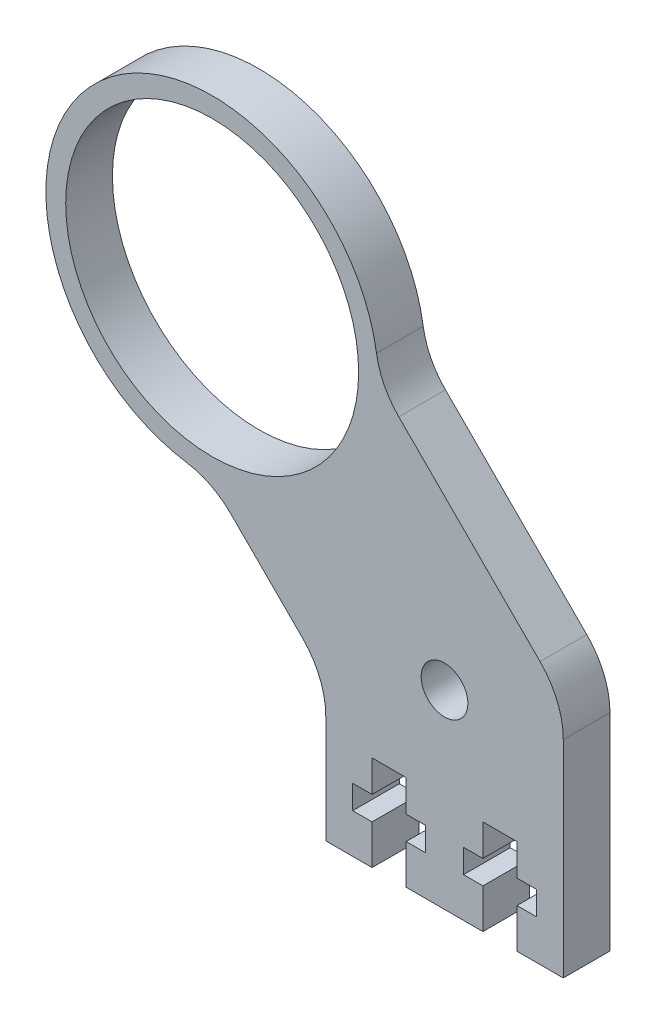
ISO-10303-21;
HEADER;
FILE_DESCRIPTION(('STEP AP214'),'2;1');
FILE_NAME('part.step','',(''),(''),'','','');
FILE_SCHEMA(('AUTOMOTIVE_DESIGN { 1 0 10303 214 1 1 1 1 }'));
ENDSEC;
DATA;
#1=APPLICATION_CONTEXT('core data for automotive mechanical design processes');
#2=APPLICATION_PROTOCOL_DEFINITION('international standard','automotive_design',2000,#1);
#3=PRODUCT_CONTEXT('',#1,'mechanical');
#4=PRODUCT('Part','Part','',(#3));
#5=PRODUCT_RELATED_PRODUCT_CATEGORY('part','',(#4));
#6=PRODUCT_DEFINITION_FORMATION('','',#4);
#7=PRODUCT_DEFINITION_CONTEXT('part definition',#1,'design');
#8=PRODUCT_DEFINITION('design','',#6,#7);
#9=PRODUCT_DEFINITION_SHAPE('','',#8);
#10=(LENGTH_UNIT() NAMED_UNIT(*) SI_UNIT(.MILLI.,.METRE.));
#11=(NAMED_UNIT(*) PLANE_ANGLE_UNIT() SI_UNIT($,.RADIAN.));
#12=(NAMED_UNIT(*) SI_UNIT($,.STERADIAN.) SOLID_ANGLE_UNIT());
#13=UNCERTAINTY_MEASURE_WITH_UNIT(LENGTH_MEASURE(1.E-05),#10,'distance_accuracy_value','');
#14=(GEOMETRIC_REPRESENTATION_CONTEXT(3) GLOBAL_UNCERTAINTY_ASSIGNED_CONTEXT((#13)) GLOBAL_UNIT_ASSIGNED_CONTEXT((#10,
#11,#12)) REPRESENTATION_CONTEXT('',''));
#15=CARTESIAN_POINT('',(0.,0.,0.));
#16=DIRECTION('',(0.,0.,1.));
#17=DIRECTION('',(1.,0.,0.));
#18=AXIS2_PLACEMENT_3D('',#15,#16,#17);
#19=CARTESIAN_POINT('',(-15.,-24.,5.9));
#20=DIRECTION('',(0.,1.,0.));
#21=DIRECTION('',(-1.,0.,0.));
#22=AXIS2_PLACEMENT_3D('',#19,#20,#21);
#23=PLANE('',#22);
#24=DIRECTION('',(1.,0.,0.));
#25=VECTOR('',#24,1.);
#26=CARTESIAN_POINT('',(-15.,-24.,5.9));
#27=LINE('',#26,#25);
#28=CARTESIAN_POINT('',(9.15000000000001,-24.,5.9));
#29=VERTEX_POINT('',#28);
#30=CARTESIAN_POINT('',(15.,-24.,5.9));
#31=VERTEX_POINT('',#30);
#32=EDGE_CURVE('E480',#29,#31,#27,.T.);
#33=ORIENTED_EDGE('',*,*,#32,.F.);
#34=DIRECTION('',(0.,0.,1.));
#35=VECTOR('',#34,1.);
#36=CARTESIAN_POINT('',(9.15000000000001,-24.,0.));
#37=LINE('',#36,#35);
#38=CARTESIAN_POINT('',(9.15000000000001,-24.,0.));
#39=VERTEX_POINT('',#38);
#40=EDGE_CURVE('E362',#39,#29,#37,.T.);
#41=ORIENTED_EDGE('',*,*,#40,.F.);
#42=DIRECTION('',(1.,0.,0.));
#43=VECTOR('',#42,1.);
#44=CARTESIAN_POINT('',(-15.,-24.,0.));
#45=LINE('',#44,#43);
#46=CARTESIAN_POINT('',(15.,-24.,0.));
#47=VERTEX_POINT('',#46);
#48=EDGE_CURVE('E498',#39,#47,#45,.T.);
#49=ORIENTED_EDGE('',*,*,#48,.T.);
#50=DIRECTION('',(0.,0.,-1.));
#51=VECTOR('',#50,1.);
#52=CARTESIAN_POINT('',(15.,-24.,5.9));
#53=LINE('',#52,#51);
#54=EDGE_CURVE('E491',#31,#47,#53,.T.);
#55=ORIENTED_EDGE('',*,*,#54,.F.);
#56=EDGE_LOOP('',(#33,#41,#49,#55));
#57=FACE_BOUND('',#56,.T.);
#58=ADVANCED_FACE('F45',(#57),#23,.F.);
#59=CARTESIAN_POINT('',(-15.,-24.,0.));
#60=VERTEX_POINT('',#59);
#61=CARTESIAN_POINT('',(-9.15,-24.,0.));
#62=VERTEX_POINT('',#61);
#63=EDGE_CURVE('E499',#60,#62,#45,.T.);
#64=ORIENTED_EDGE('',*,*,#63,.T.);
#65=DIRECTION('',(0.,0.,1.));
#66=VECTOR('',#65,1.);
#67=CARTESIAN_POINT('',(-9.15,-24.,0.));
#68=LINE('',#67,#66);
#69=CARTESIAN_POINT('',(-9.15,-24.,5.9));
#70=VERTEX_POINT('',#69);
#71=EDGE_CURVE('E404',#62,#70,#68,.T.);
#72=ORIENTED_EDGE('',*,*,#71,.T.);
#73=CARTESIAN_POINT('',(-15.,-24.,5.9));
#74=VERTEX_POINT('',#73);
#75=EDGE_CURVE('E481',#74,#70,#27,.T.);
#76=ORIENTED_EDGE('',*,*,#75,.F.);
#77=DIRECTION('',(0.,0.,-1.));
#78=VECTOR('',#77,1.);
#79=CARTESIAN_POINT('',(-15.,-24.,5.9));
#80=LINE('',#79,#78);
#81=EDGE_CURVE('E510',#74,#60,#80,.T.);
#82=ORIENTED_EDGE('',*,*,#81,.T.);
#83=EDGE_LOOP('',(#64,#72,#76,#82));
#84=FACE_BOUND('',#83,.T.);
#85=ADVANCED_FACE('F565',(#84),#23,.F.);
#86=CARTESIAN_POINT('',(-29.3449314192418,29.3449314192417,5.9));
#87=DIRECTION('',(0.,0.,1.));
#88=DIRECTION('',(1.,0.,0.));
#89=AXIS2_PLACEMENT_3D('',#86,#87,#88);
#90=PLANE('',#89);
#91=DIRECTION('',(0.,1.,0.));
#92=VECTOR('',#91,1.);
#93=CARTESIAN_POINT('',(15.,-24.,5.9));
#94=LINE('',#93,#92);
#95=CARTESIAN_POINT('',(15.,2.07106781186548,5.9));
#96=VERTEX_POINT('',#95);
#97=EDGE_CURVE('E484',#31,#96,#94,.T.);
#98=ORIENTED_EDGE('',*,*,#97,.T.);
#99=CARTESIAN_POINT('',(5.,2.07106781186548,5.9));
#100=DIRECTION('',(0.,0.,1.));
#101=DIRECTION('',(1.,0.,0.));
#102=AXIS2_PLACEMENT_3D('',#99,#100,#101);
#103=CIRCLE('',#102,10.);
#104=CARTESIAN_POINT('',(12.0710678118655,9.14213562373097,5.9));
#105=VERTEX_POINT('',#104);
#106=EDGE_CURVE('E527',#96,#105,#103,.T.);
#107=ORIENTED_EDGE('',*,*,#106,.T.);
#108=DIRECTION('',(-0.707106781186549,0.707106781186546,0.));
#109=VECTOR('',#108,1.);
#110=CARTESIAN_POINT('',(15.,6.21320343559644,5.9));
#111=LINE('',#110,#109);
#112=CARTESIAN_POINT('',(-5.77684830462785,26.9900517402242,5.9));
#113=VERTEX_POINT('',#112);
#114=EDGE_CURVE('E488',#105,#113,#111,.T.);
#115=ORIENTED_EDGE('',*,*,#114,.T.);
#116=CARTESIAN_POINT('',(1.29421950723762,34.0611195520897,5.9));
#117=DIRECTION('',(0.,0.,1.));
#118=DIRECTION('',(1.,0.,0.));
#119=AXIS2_PLACEMENT_3D('',#116,#117,#118);
#120=CIRCLE('',#119,10.);
#121=CARTESIAN_POINT('',(-8.58937756582025,32.5397685414936,5.9));
#122=VERTEX_POINT('',#121);
#123=EDGE_CURVE('E538',#113,#122,#120,.F.);
#124=ORIENTED_EDGE('',*,*,#123,.T.);
#125=CARTESIAN_POINT('',(-29.3449314192418,29.3449314192417,5.9));
#126=DIRECTION('',(0.,0.,1.));
#127=DIRECTION('',(1.,0.,0.));
#128=AXIS2_PLACEMENT_3D('',#125,#126,#127);
#129=CIRCLE('',#128,21.);
#130=CARTESIAN_POINT('',(-32.5397685414936,8.58937756582013,5.9));
#131=VERTEX_POINT('',#130);
#132=EDGE_CURVE('E472',#122,#131,#129,.T.);
#133=ORIENTED_EDGE('',*,*,#132,.T.);
#134=CARTESIAN_POINT('',(-34.0611195520897,-1.29421950723775,5.9));
#135=DIRECTION('',(0.,0.,1.));
#136=DIRECTION('',(1.,0.,0.));
#137=AXIS2_PLACEMENT_3D('',#134,#135,#136);
#138=CIRCLE('',#137,10.);
#139=CARTESIAN_POINT('',(-26.9900517402242,5.77684830462775,5.9));
#140=VERTEX_POINT('',#139);
#141=EDGE_CURVE('E13',#131,#140,#138,.F.);
#142=ORIENTED_EDGE('',*,*,#141,.T.);
#143=DIRECTION('',(0.707106781186549,-0.707106781186546,0.));
#144=VECTOR('',#143,1.);
#145=CARTESIAN_POINT('',(-15.,-6.21320343559645,5.9));
#146=LINE('',#145,#144);
#147=CARTESIAN_POINT('',(-17.9289321881345,-3.28427124746192,5.9));
#148=VERTEX_POINT('',#147);
#149=EDGE_CURVE('E475',#140,#148,#146,.T.);
#150=ORIENTED_EDGE('',*,*,#149,.T.);
#151=CARTESIAN_POINT('',(-25.,-10.3553390593274,5.9));
#152=DIRECTION('',(0.,0.,1.));
#153=DIRECTION('',(1.,0.,0.));
#154=AXIS2_PLACEMENT_3D('',#151,#152,#153);
#155=CIRCLE('',#154,10.);
#156=CARTESIAN_POINT('',(-15.,-10.3553390593274,5.9));
#157=VERTEX_POINT('',#156);
#158=EDGE_CURVE('E60',#148,#157,#155,.F.);
#159=ORIENTED_EDGE('',*,*,#158,.T.);
#160=DIRECTION('',(0.,-1.,0.));
#161=VECTOR('',#160,1.);
#162=CARTESIAN_POINT('',(-15.,-6.21320343559645,5.9));
#163=LINE('',#162,#161);
#164=EDGE_CURVE('E478',#157,#74,#163,.T.);
#165=ORIENTED_EDGE('',*,*,#164,.T.);
#166=ORIENTED_EDGE('',*,*,#75,.T.);
#167=DIRECTION('',(0.,-1.,0.));
#168=VECTOR('',#167,1.);
#169=CARTESIAN_POINT('',(-9.15,-24.,5.9));
#170=LINE('',#169,#168);
#171=CARTESIAN_POINT('',(-9.15,-19.,5.9));
#172=VERTEX_POINT('',#171);
#173=EDGE_CURVE('E349',#172,#70,#170,.T.);
#174=ORIENTED_EDGE('',*,*,#173,.F.);
#175=DIRECTION('',(1.,0.,0.));
#176=VECTOR('',#175,1.);
#177=CARTESIAN_POINT('',(-11.6,-19.,5.9));
#178=LINE('',#177,#176);
#179=CARTESIAN_POINT('',(-11.6,-19.,5.9));
#180=VERTEX_POINT('',#179);
#181=EDGE_CURVE('E374',#180,#172,#178,.T.);
#182=ORIENTED_EDGE('',*,*,#181,.F.);
#183=DIRECTION('',(0.,-1.,0.));
#184=VECTOR('',#183,1.);
#185=CARTESIAN_POINT('',(-11.6,-16.,5.9));
#186=LINE('',#185,#184);
#187=CARTESIAN_POINT('',(-11.6,-16.,5.9));
#188=VERTEX_POINT('',#187);
#189=EDGE_CURVE('E430',#188,#180,#186,.T.);
#190=ORIENTED_EDGE('',*,*,#189,.F.);
#191=DIRECTION('',(-1.,0.,0.));
#192=VECTOR('',#191,1.);
#193=CARTESIAN_POINT('',(-11.6,-16.,5.9));
#194=LINE('',#193,#192);
#195=CARTESIAN_POINT('',(-9.15,-16.,5.9));
#196=VERTEX_POINT('',#195);
#197=EDGE_CURVE('E427',#196,#188,#194,.T.);
#198=ORIENTED_EDGE('',*,*,#197,.F.);
#199=DIRECTION('',(0.,-1.,0.));
#200=VECTOR('',#199,1.);
#201=CARTESIAN_POINT('',(-9.15,-16.,5.9));
#202=LINE('',#201,#200);
#203=CARTESIAN_POINT('',(-9.15,-12.,5.9));
#204=VERTEX_POINT('',#203);
#205=EDGE_CURVE('E424',#204,#196,#202,.T.);
#206=ORIENTED_EDGE('',*,*,#205,.F.);
#207=DIRECTION('',(-1.,0.,0.));
#208=VECTOR('',#207,1.);
#209=CARTESIAN_POINT('',(-9.15,-12.,5.9));
#210=LINE('',#209,#208);
#211=CARTESIAN_POINT('',(-4.85,-12.,5.9));
#212=VERTEX_POINT('',#211);
#213=EDGE_CURVE('E421',#212,#204,#210,.T.);
#214=ORIENTED_EDGE('',*,*,#213,.F.);
#215=DIRECTION('',(0.,1.,0.));
#216=VECTOR('',#215,1.);
#217=CARTESIAN_POINT('',(-4.85,-16.,5.9));
#218=LINE('',#217,#216);
#219=CARTESIAN_POINT('',(-4.85,-16.,5.9));
#220=VERTEX_POINT('',#219);
#221=EDGE_CURVE('E418',#220,#212,#218,.T.);
#222=ORIENTED_EDGE('',*,*,#221,.F.);
#223=DIRECTION('',(-1.,0.,0.));
#224=VECTOR('',#223,1.);
#225=CARTESIAN_POINT('',(-4.85,-16.,5.9));
#226=LINE('',#225,#224);
#227=CARTESIAN_POINT('',(-2.4,-16.,5.9));
#228=VERTEX_POINT('',#227);
#229=EDGE_CURVE('E415',#228,#220,#226,.T.);
#230=ORIENTED_EDGE('',*,*,#229,.F.);
#231=DIRECTION('',(0.,1.,0.));
#232=VECTOR('',#231,1.);
#233=CARTESIAN_POINT('',(-2.4,-16.,5.9));
#234=LINE('',#233,#232);
#235=CARTESIAN_POINT('',(-2.4,-19.,5.9));
#236=VERTEX_POINT('',#235);
#237=EDGE_CURVE('E412',#236,#228,#234,.T.);
#238=ORIENTED_EDGE('',*,*,#237,.F.);
#239=DIRECTION('',(1.,0.,0.));
#240=VECTOR('',#239,1.);
#241=CARTESIAN_POINT('',(-4.85,-19.,5.9));
#242=LINE('',#241,#240);
#243=CARTESIAN_POINT('',(-4.85,-19.,5.9));
#244=VERTEX_POINT('',#243);
#245=EDGE_CURVE('E409',#244,#236,#242,.T.);
#246=ORIENTED_EDGE('',*,*,#245,.F.);
#247=DIRECTION('',(0.,1.,0.));
#248=VECTOR('',#247,1.);
#249=CARTESIAN_POINT('',(-4.84999999999999,-24.,5.9));
#250=LINE('',#249,#248);
#251=CARTESIAN_POINT('',(-4.84999999999999,-24.,5.9));
#252=VERTEX_POINT('',#251);
#253=EDGE_CURVE('E406',#252,#244,#250,.T.);
#254=ORIENTED_EDGE('',*,*,#253,.F.);
#255=CARTESIAN_POINT('',(4.85,-24.,5.9));
#256=VERTEX_POINT('',#255);
#257=EDGE_CURVE('E485',#252,#256,#27,.T.);
#258=ORIENTED_EDGE('',*,*,#257,.T.);
#259=DIRECTION('',(0.,-1.,0.));
#260=VECTOR('',#259,1.);
#261=CARTESIAN_POINT('',(4.85,-24.,5.9));
#262=LINE('',#261,#260);
#263=CARTESIAN_POINT('',(4.85,-19.,5.9));
#264=VERTEX_POINT('',#263);
#265=EDGE_CURVE('E328',#264,#256,#262,.T.);
#266=ORIENTED_EDGE('',*,*,#265,.F.);
#267=DIRECTION('',(1.,0.,0.));
#268=VECTOR('',#267,1.);
#269=CARTESIAN_POINT('',(4.85,-19.,5.9));
#270=LINE('',#269,#268);
#271=CARTESIAN_POINT('',(2.4,-19.,5.9));
#272=VERTEX_POINT('',#271);
#273=EDGE_CURVE('E325',#272,#264,#270,.T.);
#274=ORIENTED_EDGE('',*,*,#273,.F.);
#275=DIRECTION('',(0.,-1.,0.));
#276=VECTOR('',#275,1.);
#277=CARTESIAN_POINT('',(2.4,-16.,5.9));
#278=LINE('',#277,#276);
#279=CARTESIAN_POINT('',(2.4,-16.,5.9));
#280=VERTEX_POINT('',#279);
#281=EDGE_CURVE('E323',#280,#272,#278,.T.);
#282=ORIENTED_EDGE('',*,*,#281,.F.);
#283=DIRECTION('',(-1.,0.,0.));
#284=VECTOR('',#283,1.);
#285=CARTESIAN_POINT('',(4.85,-16.,5.9));
#286=LINE('',#285,#284);
#287=CARTESIAN_POINT('',(4.85,-16.,5.9));
#288=VERTEX_POINT('',#287);
#289=EDGE_CURVE('E274',#288,#280,#286,.T.);
#290=ORIENTED_EDGE('',*,*,#289,.F.);
#291=DIRECTION('',(0.,-1.,0.));
#292=VECTOR('',#291,1.);
#293=CARTESIAN_POINT('',(4.85,-16.,5.9));
#294=LINE('',#293,#292);
#295=CARTESIAN_POINT('',(4.85,-12.,5.9));
#296=VERTEX_POINT('',#295);
#297=EDGE_CURVE('E294',#296,#288,#294,.T.);
#298=ORIENTED_EDGE('',*,*,#297,.F.);
#299=DIRECTION('',(-1.,0.,0.));
#300=VECTOR('',#299,1.);
#301=CARTESIAN_POINT('',(9.15,-12.,5.9));
#302=LINE('',#301,#300);
#303=CARTESIAN_POINT('',(9.15,-12.,5.9));
#304=VERTEX_POINT('',#303);
#305=EDGE_CURVE('E297',#304,#296,#302,.T.);
#306=ORIENTED_EDGE('',*,*,#305,.F.);
#307=DIRECTION('',(0.,1.,0.));
#308=VECTOR('',#307,1.);
#309=CARTESIAN_POINT('',(9.15,-16.,5.9));
#310=LINE('',#309,#308);
#311=CARTESIAN_POINT('',(9.15,-16.,5.9));
#312=VERTEX_POINT('',#311);
#313=EDGE_CURVE('E342',#312,#304,#310,.T.);
#314=ORIENTED_EDGE('',*,*,#313,.F.);
#315=DIRECTION('',(-1.,0.,0.));
#316=VECTOR('',#315,1.);
#317=CARTESIAN_POINT('',(11.6,-16.,5.9));
#318=LINE('',#317,#316);
#319=CARTESIAN_POINT('',(11.6,-16.,5.9));
#320=VERTEX_POINT('',#319);
#321=EDGE_CURVE('E339',#320,#312,#318,.T.);
#322=ORIENTED_EDGE('',*,*,#321,.F.);
#323=DIRECTION('',(0.,1.,0.));
#324=VECTOR('',#323,1.);
#325=CARTESIAN_POINT('',(11.6,-16.,5.9));
#326=LINE('',#325,#324);
#327=CARTESIAN_POINT('',(11.6,-19.,5.9));
#328=VERTEX_POINT('',#327);
#329=EDGE_CURVE('E336',#328,#320,#326,.T.);
#330=ORIENTED_EDGE('',*,*,#329,.F.);
#331=DIRECTION('',(1.,0.,0.));
#332=VECTOR('',#331,1.);
#333=CARTESIAN_POINT('',(11.6,-19.,5.9));
#334=LINE('',#333,#332);
#335=CARTESIAN_POINT('',(9.15,-19.,5.9));
#336=VERTEX_POINT('',#335);
#337=EDGE_CURVE('E333',#336,#328,#334,.T.);
#338=ORIENTED_EDGE('',*,*,#337,.F.);
#339=DIRECTION('',(0.,1.,0.));
#340=VECTOR('',#339,1.);
#341=CARTESIAN_POINT('',(9.15000000000001,-24.,5.9));
#342=LINE('',#341,#340);
#343=EDGE_CURVE('E330',#29,#336,#342,.T.);
#344=ORIENTED_EDGE('',*,*,#343,.F.);
#345=ORIENTED_EDGE('',*,*,#32,.T.);
#346=EDGE_LOOP('',(#98,#107,#115,#124,#133,#142,#150,#159,#165,#166,#174,#182,#190,#198,#206,
#214,#222,#230,#238,#246,#254,#258,#266,#274,#282,#290,#298,#306,#314,#322,#330,#338,#344,#345));
#347=FACE_BOUND('',#346,.T.);
#348=CARTESIAN_POINT('',(-29.3449314192418,29.3449314192417,5.9));
#349=DIRECTION('',(0.,0.,1.));
#350=DIRECTION('',(1.,0.,0.));
#351=AXIS2_PLACEMENT_3D('',#348,#349,#350);
#352=CIRCLE('',#351,18.5);
#353=CARTESIAN_POINT('',(-10.8449314192418,29.3449314192417,5.9));
#354=VERTEX_POINT('',#353);
#355=EDGE_CURVE('E437',#354,#354,#352,.T.);
#356=ORIENTED_EDGE('',*,*,#355,.F.);
#357=EDGE_LOOP('',(#356));
#358=FACE_BOUND('',#357,.T.);
#359=CARTESIAN_POINT('',(0.,0.,5.9));
#360=DIRECTION('',(0.,0.,1.));
#361=DIRECTION('',(1.,0.,0.));
#362=AXIS2_PLACEMENT_3D('',#359,#360,#361);
#363=CIRCLE('',#362,2.95);
#364=CARTESIAN_POINT('',(2.95,0.,5.9));
#365=VERTEX_POINT('',#364);
#366=EDGE_CURVE('E466',#365,#365,#363,.T.);
#367=ORIENTED_EDGE('',*,*,#366,.F.);
#368=EDGE_LOOP('',(#367));
#369=FACE_BOUND('',#368,.T.);
#370=ADVANCED_FACE('F552',(#347,#358,#369),#90,.T.);
#371=CARTESIAN_POINT('',(-29.3449314192418,29.3449314192417,0.));
#372=DIRECTION('',(0.,0.,1.));
#373=DIRECTION('',(1.,0.,0.));
#374=AXIS2_PLACEMENT_3D('',#371,#372,#373);
#375=PLANE('',#374);
#376=DIRECTION('',(-0.707106781186549,0.707106781186546,0.));
#377=VECTOR('',#376,1.);
#378=CARTESIAN_POINT('',(15.,6.21320343559644,0.));
#379=LINE('',#378,#377);
#380=CARTESIAN_POINT('',(12.0710678118655,9.14213562373097,0.));
#381=VERTEX_POINT('',#380);
#382=CARTESIAN_POINT('',(-5.77684830462785,26.9900517402242,0.));
#383=VERTEX_POINT('',#382);
#384=EDGE_CURVE('E476',#381,#383,#379,.T.);
#385=ORIENTED_EDGE('',*,*,#384,.F.);
#386=CARTESIAN_POINT('',(5.,2.07106781186548,0.));
#387=DIRECTION('',(0.,0.,1.));
#388=DIRECTION('',(1.,0.,0.));
#389=AXIS2_PLACEMENT_3D('',#386,#387,#388);
#390=CIRCLE('',#389,10.);
#391=CARTESIAN_POINT('',(15.,2.07106781186548,0.));
#392=VERTEX_POINT('',#391);
#393=EDGE_CURVE('E523',#381,#392,#390,.F.);
#394=ORIENTED_EDGE('',*,*,#393,.T.);
#395=DIRECTION('',(0.,1.,0.));
#396=VECTOR('',#395,1.);
#397=CARTESIAN_POINT('',(15.,-24.,0.));
#398=LINE('',#397,#396);
#399=EDGE_CURVE('E502',#47,#392,#398,.T.);
#400=ORIENTED_EDGE('',*,*,#399,.F.);
#401=ORIENTED_EDGE('',*,*,#48,.F.);
#402=DIRECTION('',(0.,1.,0.));
#403=VECTOR('',#402,1.);
#404=CARTESIAN_POINT('',(9.15000000000001,-24.,0.));
#405=LINE('',#404,#403);
#406=CARTESIAN_POINT('',(9.15,-19.,0.));
#407=VERTEX_POINT('',#406);
#408=EDGE_CURVE('E304',#39,#407,#405,.T.);
#409=ORIENTED_EDGE('',*,*,#408,.T.);
#410=DIRECTION('',(1.,0.,0.));
#411=VECTOR('',#410,1.);
#412=CARTESIAN_POINT('',(11.6,-19.,0.));
#413=LINE('',#412,#411);
#414=CARTESIAN_POINT('',(11.6,-19.,0.));
#415=VERTEX_POINT('',#414);
#416=EDGE_CURVE('E307',#407,#415,#413,.T.);
#417=ORIENTED_EDGE('',*,*,#416,.T.);
#418=DIRECTION('',(0.,1.,0.));
#419=VECTOR('',#418,1.);
#420=CARTESIAN_POINT('',(11.6,-16.,0.));
#421=LINE('',#420,#419);
#422=CARTESIAN_POINT('',(11.6,-16.,0.));
#423=VERTEX_POINT('',#422);
#424=EDGE_CURVE('E310',#415,#423,#421,.T.);
#425=ORIENTED_EDGE('',*,*,#424,.T.);
#426=DIRECTION('',(-1.,0.,0.));
#427=VECTOR('',#426,1.);
#428=CARTESIAN_POINT('',(11.6,-16.,0.));
#429=LINE('',#428,#427);
#430=CARTESIAN_POINT('',(9.15,-16.,0.));
#431=VERTEX_POINT('',#430);
#432=EDGE_CURVE('E313',#423,#431,#429,.T.);
#433=ORIENTED_EDGE('',*,*,#432,.T.);
#434=DIRECTION('',(0.,1.,0.));
#435=VECTOR('',#434,1.);
#436=CARTESIAN_POINT('',(9.15,-16.,0.));
#437=LINE('',#436,#435);
#438=CARTESIAN_POINT('',(9.15,-12.,0.));
#439=VERTEX_POINT('',#438);
#440=EDGE_CURVE('E316',#431,#439,#437,.T.);
#441=ORIENTED_EDGE('',*,*,#440,.T.);
#442=DIRECTION('',(-1.,0.,0.));
#443=VECTOR('',#442,1.);
#444=CARTESIAN_POINT('',(9.15,-12.,0.));
#445=LINE('',#444,#443);
#446=CARTESIAN_POINT('',(4.85,-12.,0.));
#447=VERTEX_POINT('',#446);
#448=EDGE_CURVE('E319',#439,#447,#445,.T.);
#449=ORIENTED_EDGE('',*,*,#448,.T.);
#450=DIRECTION('',(0.,-1.,0.));
#451=VECTOR('',#450,1.);
#452=CARTESIAN_POINT('',(4.85,-16.,0.));
#453=LINE('',#452,#451);
#454=CARTESIAN_POINT('',(4.85,-16.,0.));
#455=VERTEX_POINT('',#454);
#456=EDGE_CURVE('E279',#447,#455,#453,.T.);
#457=ORIENTED_EDGE('',*,*,#456,.T.);
#458=DIRECTION('',(-1.,0.,0.));
#459=VECTOR('',#458,1.);
#460=CARTESIAN_POINT('',(4.85,-16.,0.));
#461=LINE('',#460,#459);
#462=CARTESIAN_POINT('',(2.4,-16.,0.));
#463=VERTEX_POINT('',#462);
#464=EDGE_CURVE('E271',#455,#463,#461,.T.);
#465=ORIENTED_EDGE('',*,*,#464,.T.);
#466=DIRECTION('',(0.,-1.,0.));
#467=VECTOR('',#466,1.);
#468=CARTESIAN_POINT('',(2.4,-16.,0.));
#469=LINE('',#468,#467);
#470=CARTESIAN_POINT('',(2.4,-19.,0.));
#471=VERTEX_POINT('',#470);
#472=EDGE_CURVE('E282',#463,#471,#469,.T.);
#473=ORIENTED_EDGE('',*,*,#472,.T.);
#474=DIRECTION('',(1.,0.,0.));
#475=VECTOR('',#474,1.);
#476=CARTESIAN_POINT('',(4.85,-19.,0.));
#477=LINE('',#476,#475);
#478=CARTESIAN_POINT('',(4.85,-19.,0.));
#479=VERTEX_POINT('',#478);
#480=EDGE_CURVE('E287',#471,#479,#477,.T.);
#481=ORIENTED_EDGE('',*,*,#480,.T.);
#482=DIRECTION('',(0.,-1.,0.));
#483=VECTOR('',#482,1.);
#484=CARTESIAN_POINT('',(4.85,-24.,0.));
#485=LINE('',#484,#483);
#486=CARTESIAN_POINT('',(4.85,-24.,0.));
#487=VERTEX_POINT('',#486);
#488=EDGE_CURVE('E301',#479,#487,#485,.T.);
#489=ORIENTED_EDGE('',*,*,#488,.T.);
#490=CARTESIAN_POINT('',(-4.85,-24.,0.));
#491=VERTEX_POINT('',#490);
#492=EDGE_CURVE('E503',#491,#487,#45,.T.);
#493=ORIENTED_EDGE('',*,*,#492,.F.);
#494=DIRECTION('',(0.,1.,0.));
#495=VECTOR('',#494,1.);
#496=CARTESIAN_POINT('',(-4.84999999999999,-24.,0.));
#497=LINE('',#496,#495);
#498=CARTESIAN_POINT('',(-4.85,-19.,0.));
#499=VERTEX_POINT('',#498);
#500=EDGE_CURVE('E373',#491,#499,#497,.T.);
#501=ORIENTED_EDGE('',*,*,#500,.T.);
#502=DIRECTION('',(1.,0.,0.));
#503=VECTOR('',#502,1.);
#504=CARTESIAN_POINT('',(-4.85,-19.,0.));
#505=LINE('',#504,#503);
#506=CARTESIAN_POINT('',(-2.4,-19.,0.));
#507=VERTEX_POINT('',#506);
#508=EDGE_CURVE('E377',#499,#507,#505,.T.);
#509=ORIENTED_EDGE('',*,*,#508,.T.);
#510=DIRECTION('',(0.,1.,0.));
#511=VECTOR('',#510,1.);
#512=CARTESIAN_POINT('',(-2.4,-16.,0.));
#513=LINE('',#512,#511);
#514=CARTESIAN_POINT('',(-2.4,-16.,0.));
#515=VERTEX_POINT('',#514);
#516=EDGE_CURVE('E380',#507,#515,#513,.T.);
#517=ORIENTED_EDGE('',*,*,#516,.T.);
#518=DIRECTION('',(-1.,0.,0.));
#519=VECTOR('',#518,1.);
#520=CARTESIAN_POINT('',(-4.85,-16.,0.));
#521=LINE('',#520,#519);
#522=CARTESIAN_POINT('',(-4.85,-16.,0.));
#523=VERTEX_POINT('',#522);
#524=EDGE_CURVE('E383',#515,#523,#521,.T.);
#525=ORIENTED_EDGE('',*,*,#524,.T.);
#526=DIRECTION('',(0.,1.,0.));
#527=VECTOR('',#526,1.);
#528=CARTESIAN_POINT('',(-4.85,-16.,0.));
#529=LINE('',#528,#527);
#530=CARTESIAN_POINT('',(-4.85,-12.,0.));
#531=VERTEX_POINT('',#530);
#532=EDGE_CURVE('E386',#523,#531,#529,.T.);
#533=ORIENTED_EDGE('',*,*,#532,.T.);
#534=DIRECTION('',(-1.,0.,0.));
#535=VECTOR('',#534,1.);
#536=CARTESIAN_POINT('',(-9.15,-12.,0.));
#537=LINE('',#536,#535);
#538=CARTESIAN_POINT('',(-9.15,-12.,0.));
#539=VERTEX_POINT('',#538);
#540=EDGE_CURVE('E389',#531,#539,#537,.T.);
#541=ORIENTED_EDGE('',*,*,#540,.T.);
#542=DIRECTION('',(0.,-1.,0.));
#543=VECTOR('',#542,1.);
#544=CARTESIAN_POINT('',(-9.15,-16.,0.));
#545=LINE('',#544,#543);
#546=CARTESIAN_POINT('',(-9.15,-16.,0.));
#547=VERTEX_POINT('',#546);
#548=EDGE_CURVE('E392',#539,#547,#545,.T.);
#549=ORIENTED_EDGE('',*,*,#548,.T.);
#550=DIRECTION('',(-1.,0.,0.));
#551=VECTOR('',#550,1.);
#552=CARTESIAN_POINT('',(-11.6,-16.,0.));
#553=LINE('',#552,#551);
#554=CARTESIAN_POINT('',(-11.6,-16.,0.));
#555=VERTEX_POINT('',#554);
#556=EDGE_CURVE('E395',#547,#555,#553,.T.);
#557=ORIENTED_EDGE('',*,*,#556,.T.);
#558=DIRECTION('',(0.,-1.,0.));
#559=VECTOR('',#558,1.);
#560=CARTESIAN_POINT('',(-11.6,-16.,0.));
#561=LINE('',#560,#559);
#562=CARTESIAN_POINT('',(-11.6,-19.,0.));
#563=VERTEX_POINT('',#562);
#564=EDGE_CURVE('E398',#555,#563,#561,.T.);
#565=ORIENTED_EDGE('',*,*,#564,.T.);
#566=DIRECTION('',(1.,0.,0.));
#567=VECTOR('',#566,1.);
#568=CARTESIAN_POINT('',(-11.6,-19.,0.));
#569=LINE('',#568,#567);
#570=CARTESIAN_POINT('',(-9.15,-19.,0.));
#571=VERTEX_POINT('',#570);
#572=EDGE_CURVE('E401',#563,#571,#569,.T.);
#573=ORIENTED_EDGE('',*,*,#572,.T.);
#574=DIRECTION('',(0.,-1.,0.));
#575=VECTOR('',#574,1.);
#576=CARTESIAN_POINT('',(-9.15,-24.,0.));
#577=LINE('',#576,#575);
#578=EDGE_CURVE('E370',#571,#62,#577,.T.);
#579=ORIENTED_EDGE('',*,*,#578,.T.);
#580=ORIENTED_EDGE('',*,*,#63,.F.);
#581=DIRECTION('',(0.,-1.,0.));
#582=VECTOR('',#581,1.);
#583=CARTESIAN_POINT('',(-15.,-6.21320343559645,0.));
#584=LINE('',#583,#582);
#585=CARTESIAN_POINT('',(-15.,-10.3553390593274,0.));
#586=VERTEX_POINT('',#585);
#587=EDGE_CURVE('E496',#586,#60,#584,.T.);
#588=ORIENTED_EDGE('',*,*,#587,.F.);
#589=CARTESIAN_POINT('',(-25.,-10.3553390593274,0.));
#590=DIRECTION('',(0.,0.,1.));
#591=DIRECTION('',(1.,0.,0.));
#592=AXIS2_PLACEMENT_3D('',#589,#590,#591);
#593=CIRCLE('',#592,10.);
#594=CARTESIAN_POINT('',(-17.9289321881345,-3.28427124746192,0.));
#595=VERTEX_POINT('',#594);
#596=EDGE_CURVE('E540',#586,#595,#593,.T.);
#597=ORIENTED_EDGE('',*,*,#596,.T.);
#598=DIRECTION('',(0.707106781186549,-0.707106781186546,0.));
#599=VECTOR('',#598,1.);
#600=CARTESIAN_POINT('',(-15.,-6.21320343559645,0.));
#601=LINE('',#600,#599);
#602=CARTESIAN_POINT('',(-26.9900517402242,5.77684830462775,0.));
#603=VERTEX_POINT('',#602);
#604=EDGE_CURVE('E494',#603,#595,#601,.T.);
#605=ORIENTED_EDGE('',*,*,#604,.F.);
#606=CARTESIAN_POINT('',(-34.0611195520897,-1.29421950723775,0.));
#607=DIRECTION('',(0.,0.,1.));
#608=DIRECTION('',(1.,0.,0.));
#609=AXIS2_PLACEMENT_3D('',#606,#607,#608);
#610=CIRCLE('',#609,10.);
#611=CARTESIAN_POINT('',(-32.5397685414936,8.58937756582013,0.));
#612=VERTEX_POINT('',#611);
#613=EDGE_CURVE('E53',#603,#612,#610,.T.);
#614=ORIENTED_EDGE('',*,*,#613,.T.);
#615=CARTESIAN_POINT('',(-29.3449314192418,29.3449314192417,0.));
#616=DIRECTION('',(0.,0.,1.));
#617=DIRECTION('',(1.,0.,0.));
#618=AXIS2_PLACEMENT_3D('',#615,#616,#617);
#619=CIRCLE('',#618,21.);
#620=CARTESIAN_POINT('',(-8.58937756582025,32.5397685414936,0.));
#621=VERTEX_POINT('',#620);
#622=EDGE_CURVE('E469',#621,#612,#619,.T.);
#623=ORIENTED_EDGE('',*,*,#622,.F.);
#624=CARTESIAN_POINT('',(1.29421950723762,34.0611195520897,0.));
#625=DIRECTION('',(0.,0.,1.));
#626=DIRECTION('',(1.,0.,0.));
#627=AXIS2_PLACEMENT_3D('',#624,#625,#626);
#628=CIRCLE('',#627,10.);
#629=EDGE_CURVE('E536',#621,#383,#628,.T.);
#630=ORIENTED_EDGE('',*,*,#629,.T.);
#631=EDGE_LOOP('',(#385,#394,#400,#401,#409,#417,#425,#433,#441,#449,#457,#465,#473,#481,#489,
#493,#501,#509,#517,#525,#533,#541,#549,#557,#565,#573,#579,#580,#588,#597,#605,#614,#623,#630));
#632=FACE_BOUND('',#631,.T.);
#633=CARTESIAN_POINT('',(-29.3449314192418,29.3449314192417,0.));
#634=DIRECTION('',(0.,0.,1.));
#635=DIRECTION('',(1.,0.,0.));
#636=AXIS2_PLACEMENT_3D('',#633,#634,#635);
#637=CIRCLE('',#636,18.5);
#638=CARTESIAN_POINT('',(-10.8449314192418,29.3449314192417,0.));
#639=VERTEX_POINT('',#638);
#640=EDGE_CURVE('E460',#639,#639,#637,.T.);
#641=ORIENTED_EDGE('',*,*,#640,.T.);
#642=EDGE_LOOP('',(#641));
#643=FACE_BOUND('',#642,.T.);
#644=CARTESIAN_POINT('',(0.,0.,0.));
#645=DIRECTION('',(0.,0.,1.));
#646=DIRECTION('',(1.,0.,0.));
#647=AXIS2_PLACEMENT_3D('',#644,#645,#646);
#648=CIRCLE('',#647,2.95);
#649=CARTESIAN_POINT('',(2.95,0.,0.));
#650=VERTEX_POINT('',#649);
#651=EDGE_CURVE('E463',#650,#650,#648,.T.);
#652=ORIENTED_EDGE('',*,*,#651,.T.);
#653=EDGE_LOOP('',(#652));
#654=FACE_BOUND('',#653,.T.);
#655=ADVANCED_FACE('F290',(#632,#643,#654),#375,.F.);
#656=CARTESIAN_POINT('',(-29.3449314192418,29.3449314192417,5.9));
#657=DIRECTION('',(0.,0.,-1.));
#658=DIRECTION('',(-1.,0.,0.));
#659=AXIS2_PLACEMENT_3D('',#656,#657,#658);
#660=CYLINDRICAL_SURFACE('',#659,21.);
#661=ORIENTED_EDGE('',*,*,#132,.F.);
#662=DIRECTION('',(0.,0.,-1.));
#663=VECTOR('',#662,1.);
#664=CARTESIAN_POINT('',(-8.58937756582025,32.5397685414936,5.9));
#665=LINE('',#664,#663);
#666=EDGE_CURVE('E515',#122,#621,#665,.T.);
#667=ORIENTED_EDGE('',*,*,#666,.T.);
#668=ORIENTED_EDGE('',*,*,#622,.T.);
#669=DIRECTION('',(0.,0.,-1.));
#670=VECTOR('',#669,1.);
#671=CARTESIAN_POINT('',(-32.5397685414936,8.58937756582013,5.9));
#672=LINE('',#671,#670);
#673=EDGE_CURVE('E513',#612,#131,#672,.F.);
#674=ORIENTED_EDGE('',*,*,#673,.T.);
#675=EDGE_LOOP('',(#661,#667,#668,#674));
#676=FACE_BOUND('',#675,.T.);
#677=ADVANCED_FACE('F549',(#676),#660,.T.);
#678=CARTESIAN_POINT('',(-15.,-6.21320343559645,5.9));
#679=DIRECTION('',(0.707106781186546,0.707106781186549,0.));
#680=DIRECTION('',(-0.707106781186549,0.707106781186546,0.));
#681=AXIS2_PLACEMENT_3D('',#678,#679,#680);
#682=PLANE('',#681);
#683=ORIENTED_EDGE('',*,*,#604,.T.);
#684=DIRECTION('',(0.,0.,-1.));
#685=VECTOR('',#684,1.);
#686=CARTESIAN_POINT('',(-17.9289321881345,-3.28427124746192,5.9));
#687=LINE('',#686,#685);
#688=EDGE_CURVE('E68',#595,#148,#687,.F.);
#689=ORIENTED_EDGE('',*,*,#688,.T.);
#690=ORIENTED_EDGE('',*,*,#149,.F.);
#691=DIRECTION('',(0.,0.,1.));
#692=VECTOR('',#691,1.);
#693=CARTESIAN_POINT('',(-26.9900517402242,5.77684830462775,0.));
#694=LINE('',#693,#692);
#695=EDGE_CURVE('E532',#140,#603,#694,.F.);
#696=ORIENTED_EDGE('',*,*,#695,.T.);
#697=EDGE_LOOP('',(#683,#689,#690,#696));
#698=FACE_BOUND('',#697,.T.);
#699=ADVANCED_FACE('F554',(#698),#682,.F.);
#700=CARTESIAN_POINT('',(-15.,-6.21320343559645,5.9));
#701=DIRECTION('',(1.,0.,0.));
#702=DIRECTION('',(0.,1.,0.));
#703=AXIS2_PLACEMENT_3D('',#700,#701,#702);
#704=PLANE('',#703);
#705=ORIENTED_EDGE('',*,*,#164,.F.);
#706=DIRECTION('',(0.,0.,-1.));
#707=VECTOR('',#706,1.);
#708=CARTESIAN_POINT('',(-15.,-10.3553390593274,0.));
#709=LINE('',#708,#707);
#710=EDGE_CURVE('E529',#157,#586,#709,.T.);
#711=ORIENTED_EDGE('',*,*,#710,.T.);
#712=ORIENTED_EDGE('',*,*,#587,.T.);
#713=ORIENTED_EDGE('',*,*,#81,.F.);
#714=EDGE_LOOP('',(#705,#711,#712,#713));
#715=FACE_BOUND('',#714,.T.);
#716=ADVANCED_FACE('F560',(#715),#704,.F.);
#717=ORIENTED_EDGE('',*,*,#492,.T.);
#718=DIRECTION('',(0.,0.,1.));
#719=VECTOR('',#718,1.);
#720=CARTESIAN_POINT('',(4.85,-24.,0.));
#721=LINE('',#720,#719);
#722=EDGE_CURVE('E364',#487,#256,#721,.T.);
#723=ORIENTED_EDGE('',*,*,#722,.T.);
#724=ORIENTED_EDGE('',*,*,#257,.F.);
#725=DIRECTION('',(0.,0.,1.));
#726=VECTOR('',#725,1.);
#727=CARTESIAN_POINT('',(-4.84999999999999,-24.,0.));
#728=LINE('',#727,#726);
#729=EDGE_CURVE('E456',#491,#252,#728,.T.);
#730=ORIENTED_EDGE('',*,*,#729,.F.);
#731=EDGE_LOOP('',(#717,#723,#724,#730));
#732=FACE_BOUND('',#731,.T.);
#733=ADVANCED_FACE('F615',(#732),#23,.F.);
#734=CARTESIAN_POINT('',(15.,-24.,5.9));
#735=DIRECTION('',(-1.,0.,0.));
#736=DIRECTION('',(0.,-1.,0.));
#737=AXIS2_PLACEMENT_3D('',#734,#735,#736);
#738=PLANE('',#737);
#739=ORIENTED_EDGE('',*,*,#399,.T.);
#740=DIRECTION('',(0.,0.,-1.));
#741=VECTOR('',#740,1.);
#742=CARTESIAN_POINT('',(15.,2.07106781186548,5.9));
#743=LINE('',#742,#741);
#744=EDGE_CURVE('E525',#392,#96,#743,.F.);
#745=ORIENTED_EDGE('',*,*,#744,.T.);
#746=ORIENTED_EDGE('',*,*,#97,.F.);
#747=ORIENTED_EDGE('',*,*,#54,.T.);
#748=EDGE_LOOP('',(#739,#745,#746,#747));
#749=FACE_BOUND('',#748,.T.);
#750=ADVANCED_FACE('F625',(#749),#738,.F.);
#751=CARTESIAN_POINT('',(15.,6.21320343559644,5.9));
#752=DIRECTION('',(-0.707106781186546,-0.707106781186549,0.));
#753=DIRECTION('',(0.707106781186549,-0.707106781186546,0.));
#754=AXIS2_PLACEMENT_3D('',#751,#752,#753);
#755=PLANE('',#754);
#756=ORIENTED_EDGE('',*,*,#384,.T.);
#757=DIRECTION('',(0.,0.,1.));
#758=VECTOR('',#757,1.);
#759=CARTESIAN_POINT('',(-5.77684830462785,26.9900517402242,5.9));
#760=LINE('',#759,#758);
#761=EDGE_CURVE('E521',#383,#113,#760,.T.);
#762=ORIENTED_EDGE('',*,*,#761,.T.);
#763=ORIENTED_EDGE('',*,*,#114,.F.);
#764=DIRECTION('',(0.,0.,-1.));
#765=VECTOR('',#764,1.);
#766=CARTESIAN_POINT('',(12.0710678118655,9.14213562373097,5.9));
#767=LINE('',#766,#765);
#768=EDGE_CURVE('E518',#105,#381,#767,.T.);
#769=ORIENTED_EDGE('',*,*,#768,.T.);
#770=EDGE_LOOP('',(#756,#762,#763,#769));
#771=FACE_BOUND('',#770,.T.);
#772=ADVANCED_FACE('F633',(#771),#755,.F.);
#773=CARTESIAN_POINT('',(0.,0.,5.9));
#774=DIRECTION('',(0.,0.,-1.));
#775=DIRECTION('',(-1.,0.,0.));
#776=AXIS2_PLACEMENT_3D('',#773,#774,#775);
#777=CYLINDRICAL_SURFACE('',#776,2.95);
#778=ORIENTED_EDGE('',*,*,#366,.T.);
#779=EDGE_LOOP('',(#778));
#780=FACE_BOUND('',#779,.T.);
#781=ORIENTED_EDGE('',*,*,#651,.F.);
#782=EDGE_LOOP('',(#781));
#783=FACE_BOUND('',#782,.T.);
#784=ADVANCED_FACE('F676',(#780,#783),#777,.F.);
#785=CARTESIAN_POINT('',(-29.3449314192418,29.3449314192417,0.));
#786=DIRECTION('',(0.,0.,1.));
#787=DIRECTION('',(1.,0.,0.));
#788=AXIS2_PLACEMENT_3D('',#785,#786,#787);
#789=CYLINDRICAL_SURFACE('',#788,18.5);
#790=ORIENTED_EDGE('',*,*,#640,.F.);
#791=EDGE_LOOP('',(#790));
#792=FACE_BOUND('',#791,.T.);
#793=ORIENTED_EDGE('',*,*,#355,.T.);
#794=EDGE_LOOP('',(#793));
#795=FACE_BOUND('',#794,.T.);
#796=ADVANCED_FACE('F680',(#792,#795),#789,.F.);
#797=CARTESIAN_POINT('',(-9.15,-24.,0.));
#798=DIRECTION('',(-1.,0.,0.));
#799=DIRECTION('',(0.,0.,1.));
#800=AXIS2_PLACEMENT_3D('',#797,#798,#799);
#801=PLANE('',#800);
#802=ORIENTED_EDGE('',*,*,#173,.T.);
#803=ORIENTED_EDGE('',*,*,#71,.F.);
#804=ORIENTED_EDGE('',*,*,#578,.F.);
#805=DIRECTION('',(0.,0.,1.));
#806=VECTOR('',#805,1.);
#807=CARTESIAN_POINT('',(-9.15,-19.,0.));
#808=LINE('',#807,#806);
#809=EDGE_CURVE('E435',#571,#172,#808,.T.);
#810=ORIENTED_EDGE('',*,*,#809,.T.);
#811=EDGE_LOOP('',(#802,#803,#804,#810));
#812=FACE_BOUND('',#811,.T.);
#813=ADVANCED_FACE('F571',(#812),#801,.F.);
#814=CARTESIAN_POINT('',(-11.6,-19.,0.));
#815=DIRECTION('',(0.,-1.,0.));
#816=DIRECTION('',(0.,0.,-1.));
#817=AXIS2_PLACEMENT_3D('',#814,#815,#816);
#818=PLANE('',#817);
#819=ORIENTED_EDGE('',*,*,#181,.T.);
#820=ORIENTED_EDGE('',*,*,#809,.F.);
#821=ORIENTED_EDGE('',*,*,#572,.F.);
#822=DIRECTION('',(0.,0.,1.));
#823=VECTOR('',#822,1.);
#824=CARTESIAN_POINT('',(-11.6,-19.,0.));
#825=LINE('',#824,#823);
#826=EDGE_CURVE('E438',#563,#180,#825,.T.);
#827=ORIENTED_EDGE('',*,*,#826,.T.);
#828=EDGE_LOOP('',(#819,#820,#821,#827));
#829=FACE_BOUND('',#828,.T.);
#830=ADVANCED_FACE('F574',(#829),#818,.F.);
#831=CARTESIAN_POINT('',(-11.6,-16.,0.));
#832=DIRECTION('',(-1.,0.,0.));
#833=DIRECTION('',(0.,-1.,0.));
#834=AXIS2_PLACEMENT_3D('',#831,#832,#833);
#835=PLANE('',#834);
#836=ORIENTED_EDGE('',*,*,#189,.T.);
#837=ORIENTED_EDGE('',*,*,#826,.F.);
#838=ORIENTED_EDGE('',*,*,#564,.F.);
#839=DIRECTION('',(0.,0.,1.));
#840=VECTOR('',#839,1.);
#841=CARTESIAN_POINT('',(-11.6,-16.,0.));
#842=LINE('',#841,#840);
#843=EDGE_CURVE('E440',#555,#188,#842,.T.);
#844=ORIENTED_EDGE('',*,*,#843,.T.);
#845=EDGE_LOOP('',(#836,#837,#838,#844));
#846=FACE_BOUND('',#845,.T.);
#847=ADVANCED_FACE('F577',(#846),#835,.F.);
#848=CARTESIAN_POINT('',(-11.6,-16.,0.));
#849=DIRECTION('',(0.,1.,0.));
#850=DIRECTION('',(0.,0.,1.));
#851=AXIS2_PLACEMENT_3D('',#848,#849,#850);
#852=PLANE('',#851);
#853=ORIENTED_EDGE('',*,*,#197,.T.);
#854=ORIENTED_EDGE('',*,*,#843,.F.);
#855=ORIENTED_EDGE('',*,*,#556,.F.);
#856=DIRECTION('',(0.,0.,1.));
#857=VECTOR('',#856,1.);
#858=CARTESIAN_POINT('',(-9.15,-16.,0.));
#859=LINE('',#858,#857);
#860=EDGE_CURVE('E442',#547,#196,#859,.T.);
#861=ORIENTED_EDGE('',*,*,#860,.T.);
#862=EDGE_LOOP('',(#853,#854,#855,#861));
#863=FACE_BOUND('',#862,.T.);
#864=ADVANCED_FACE('F582',(#863),#852,.F.);
#865=CARTESIAN_POINT('',(-9.15,-16.,0.));
#866=DIRECTION('',(-1.,0.,0.));
#867=DIRECTION('',(0.,-1.,0.));
#868=AXIS2_PLACEMENT_3D('',#865,#866,#867);
#869=PLANE('',#868);
#870=ORIENTED_EDGE('',*,*,#205,.T.);
#871=ORIENTED_EDGE('',*,*,#860,.F.);
#872=ORIENTED_EDGE('',*,*,#548,.F.);
#873=DIRECTION('',(0.,0.,1.));
#874=VECTOR('',#873,1.);
#875=CARTESIAN_POINT('',(-9.15,-12.,0.));
#876=LINE('',#875,#874);
#877=EDGE_CURVE('E444',#539,#204,#876,.T.);
#878=ORIENTED_EDGE('',*,*,#877,.T.);
#879=EDGE_LOOP('',(#870,#871,#872,#878));
#880=FACE_BOUND('',#879,.T.);
#881=ADVANCED_FACE('F586',(#880),#869,.F.);
#882=CARTESIAN_POINT('',(-9.15,-12.,0.));
#883=DIRECTION('',(0.,1.,0.));
#884=DIRECTION('',(0.,0.,1.));
#885=AXIS2_PLACEMENT_3D('',#882,#883,#884);
#886=PLANE('',#885);
#887=ORIENTED_EDGE('',*,*,#213,.T.);
#888=ORIENTED_EDGE('',*,*,#877,.F.);
#889=ORIENTED_EDGE('',*,*,#540,.F.);
#890=DIRECTION('',(0.,0.,1.));
#891=VECTOR('',#890,1.);
#892=CARTESIAN_POINT('',(-4.85,-12.,0.));
#893=LINE('',#892,#891);
#894=EDGE_CURVE('E446',#531,#212,#893,.T.);
#895=ORIENTED_EDGE('',*,*,#894,.T.);
#896=EDGE_LOOP('',(#887,#888,#889,#895));
#897=FACE_BOUND('',#896,.T.);
#898=ADVANCED_FACE('F589',(#897),#886,.F.);
#899=CARTESIAN_POINT('',(-4.85,-16.,0.));
#900=DIRECTION('',(1.,0.,0.));
#901=DIRECTION('',(0.,1.,0.));
#902=AXIS2_PLACEMENT_3D('',#899,#900,#901);
#903=PLANE('',#902);
#904=ORIENTED_EDGE('',*,*,#221,.T.);
#905=ORIENTED_EDGE('',*,*,#894,.F.);
#906=ORIENTED_EDGE('',*,*,#532,.F.);
#907=DIRECTION('',(0.,0.,1.));
#908=VECTOR('',#907,1.);
#909=CARTESIAN_POINT('',(-4.85,-16.,0.));
#910=LINE('',#909,#908);
#911=EDGE_CURVE('E448',#523,#220,#910,.T.);
#912=ORIENTED_EDGE('',*,*,#911,.T.);
#913=EDGE_LOOP('',(#904,#905,#906,#912));
#914=FACE_BOUND('',#913,.T.);
#915=ADVANCED_FACE('F594',(#914),#903,.F.);
#916=CARTESIAN_POINT('',(-4.85,-16.,0.));
#917=DIRECTION('',(0.,1.,0.));
#918=DIRECTION('',(0.,0.,1.));
#919=AXIS2_PLACEMENT_3D('',#916,#917,#918);
#920=PLANE('',#919);
#921=ORIENTED_EDGE('',*,*,#229,.T.);
#922=ORIENTED_EDGE('',*,*,#911,.F.);
#923=ORIENTED_EDGE('',*,*,#524,.F.);
#924=DIRECTION('',(0.,0.,1.));
#925=VECTOR('',#924,1.);
#926=CARTESIAN_POINT('',(-2.4,-16.,0.));
#927=LINE('',#926,#925);
#928=EDGE_CURVE('E450',#515,#228,#927,.T.);
#929=ORIENTED_EDGE('',*,*,#928,.T.);
#930=EDGE_LOOP('',(#921,#922,#923,#929));
#931=FACE_BOUND('',#930,.T.);
#932=ADVANCED_FACE('F598',(#931),#920,.F.);
#933=CARTESIAN_POINT('',(-2.4,-16.,0.));
#934=DIRECTION('',(1.,0.,0.));
#935=DIRECTION('',(0.,1.,0.));
#936=AXIS2_PLACEMENT_3D('',#933,#934,#935);
#937=PLANE('',#936);
#938=ORIENTED_EDGE('',*,*,#237,.T.);
#939=ORIENTED_EDGE('',*,*,#928,.F.);
#940=ORIENTED_EDGE('',*,*,#516,.F.);
#941=DIRECTION('',(0.,0.,1.));
#942=VECTOR('',#941,1.);
#943=CARTESIAN_POINT('',(-2.4,-19.,0.));
#944=LINE('',#943,#942);
#945=EDGE_CURVE('E452',#507,#236,#944,.T.);
#946=ORIENTED_EDGE('',*,*,#945,.T.);
#947=EDGE_LOOP('',(#938,#939,#940,#946));
#948=FACE_BOUND('',#947,.T.);
#949=ADVANCED_FACE('F601',(#948),#937,.F.);
#950=CARTESIAN_POINT('',(-4.85,-19.,0.));
#951=DIRECTION('',(0.,-1.,0.));
#952=DIRECTION('',(0.,0.,-1.));
#953=AXIS2_PLACEMENT_3D('',#950,#951,#952);
#954=PLANE('',#953);
#955=ORIENTED_EDGE('',*,*,#245,.T.);
#956=ORIENTED_EDGE('',*,*,#945,.F.);
#957=ORIENTED_EDGE('',*,*,#508,.F.);
#958=DIRECTION('',(0.,0.,1.));
#959=VECTOR('',#958,1.);
#960=CARTESIAN_POINT('',(-4.85,-19.,0.));
#961=LINE('',#960,#959);
#962=EDGE_CURVE('E454',#499,#244,#961,.T.);
#963=ORIENTED_EDGE('',*,*,#962,.T.);
#964=EDGE_LOOP('',(#955,#956,#957,#963));
#965=FACE_BOUND('',#964,.T.);
#966=ADVANCED_FACE('F607',(#965),#954,.F.);
#967=CARTESIAN_POINT('',(-4.84999999999999,-24.,0.));
#968=DIRECTION('',(1.,0.,0.));
#969=DIRECTION('',(0.,1.,0.));
#970=AXIS2_PLACEMENT_3D('',#967,#968,#969);
#971=PLANE('',#970);
#972=ORIENTED_EDGE('',*,*,#253,.T.);
#973=ORIENTED_EDGE('',*,*,#962,.F.);
#974=ORIENTED_EDGE('',*,*,#500,.F.);
#975=ORIENTED_EDGE('',*,*,#729,.T.);
#976=EDGE_LOOP('',(#972,#973,#974,#975));
#977=FACE_BOUND('',#976,.T.);
#978=ADVANCED_FACE('F610',(#977),#971,.F.);
#979=CARTESIAN_POINT('',(4.85,-16.,0.));
#980=DIRECTION('',(0.,1.,0.));
#981=DIRECTION('',(0.,0.,1.));
#982=AXIS2_PLACEMENT_3D('',#979,#980,#981);
#983=PLANE('',#982);
#984=ORIENTED_EDGE('',*,*,#289,.T.);
#985=DIRECTION('',(0.,0.,1.));
#986=VECTOR('',#985,1.);
#987=CARTESIAN_POINT('',(2.4,-16.,0.));
#988=LINE('',#987,#986);
#989=EDGE_CURVE('E267',#463,#280,#988,.T.);
#990=ORIENTED_EDGE('',*,*,#989,.F.);
#991=ORIENTED_EDGE('',*,*,#464,.F.);
#992=DIRECTION('',(0.,0.,1.));
#993=VECTOR('',#992,1.);
#994=CARTESIAN_POINT('',(4.85,-16.,0.));
#995=LINE('',#994,#993);
#996=EDGE_CURVE('E347',#455,#288,#995,.T.);
#997=ORIENTED_EDGE('',*,*,#996,.T.);
#998=EDGE_LOOP('',(#984,#990,#991,#997));
#999=FACE_BOUND('',#998,.T.);
#1000=ADVANCED_FACE('F269',(#999),#983,.F.);
#1001=CARTESIAN_POINT('',(4.85,-16.,0.));
#1002=DIRECTION('',(-1.,0.,0.));
#1003=DIRECTION('',(0.,-1.,0.));
#1004=AXIS2_PLACEMENT_3D('',#1001,#1002,#1003);
#1005=PLANE('',#1004);
#1006=ORIENTED_EDGE('',*,*,#297,.T.);
#1007=ORIENTED_EDGE('',*,*,#996,.F.);
#1008=ORIENTED_EDGE('',*,*,#456,.F.);
#1009=DIRECTION('',(0.,0.,1.));
#1010=VECTOR('',#1009,1.);
#1011=CARTESIAN_POINT('',(4.85,-12.,0.));
#1012=LINE('',#1011,#1010);
#1013=EDGE_CURVE('E350',#447,#296,#1012,.T.);
#1014=ORIENTED_EDGE('',*,*,#1013,.T.);
#1015=EDGE_LOOP('',(#1006,#1007,#1008,#1014));
#1016=FACE_BOUND('',#1015,.T.);
#1017=ADVANCED_FACE('F712',(#1016),#1005,.F.);
#1018=CARTESIAN_POINT('',(9.15,-12.,0.));
#1019=DIRECTION('',(0.,1.,0.));
#1020=DIRECTION('',(0.,0.,1.));
#1021=AXIS2_PLACEMENT_3D('',#1018,#1019,#1020);
#1022=PLANE('',#1021);
#1023=ORIENTED_EDGE('',*,*,#305,.T.);
#1024=ORIENTED_EDGE('',*,*,#1013,.F.);
#1025=ORIENTED_EDGE('',*,*,#448,.F.);
#1026=DIRECTION('',(0.,0.,1.));
#1027=VECTOR('',#1026,1.);
#1028=CARTESIAN_POINT('',(9.15,-12.,0.));
#1029=LINE('',#1028,#1027);
#1030=EDGE_CURVE('E352',#439,#304,#1029,.T.);
#1031=ORIENTED_EDGE('',*,*,#1030,.T.);
#1032=EDGE_LOOP('',(#1023,#1024,#1025,#1031));
#1033=FACE_BOUND('',#1032,.T.);
#1034=ADVANCED_FACE('F740',(#1033),#1022,.F.);
#1035=CARTESIAN_POINT('',(9.15,-16.,0.));
#1036=DIRECTION('',(1.,0.,0.));
#1037=DIRECTION('',(0.,1.,0.));
#1038=AXIS2_PLACEMENT_3D('',#1035,#1036,#1037);
#1039=PLANE('',#1038);
#1040=ORIENTED_EDGE('',*,*,#313,.T.);
#1041=ORIENTED_EDGE('',*,*,#1030,.F.);
#1042=ORIENTED_EDGE('',*,*,#440,.F.);
#1043=DIRECTION('',(0.,0.,1.));
#1044=VECTOR('',#1043,1.);
#1045=CARTESIAN_POINT('',(9.15,-16.,0.));
#1046=LINE('',#1045,#1044);
#1047=EDGE_CURVE('E354',#431,#312,#1046,.T.);
#1048=ORIENTED_EDGE('',*,*,#1047,.T.);
#1049=EDGE_LOOP('',(#1040,#1041,#1042,#1048));
#1050=FACE_BOUND('',#1049,.T.);
#1051=ADVANCED_FACE('F736',(#1050),#1039,.F.);
#1052=CARTESIAN_POINT('',(11.6,-16.,0.));
#1053=DIRECTION('',(0.,1.,0.));
#1054=DIRECTION('',(-1.,0.,0.));
#1055=AXIS2_PLACEMENT_3D('',#1052,#1053,#1054);
#1056=PLANE('',#1055);
#1057=ORIENTED_EDGE('',*,*,#321,.T.);
#1058=ORIENTED_EDGE('',*,*,#1047,.F.);
#1059=ORIENTED_EDGE('',*,*,#432,.F.);
#1060=DIRECTION('',(0.,0.,1.));
#1061=VECTOR('',#1060,1.);
#1062=CARTESIAN_POINT('',(11.6,-16.,0.));
#1063=LINE('',#1062,#1061);
#1064=EDGE_CURVE('E356',#423,#320,#1063,.T.);
#1065=ORIENTED_EDGE('',*,*,#1064,.T.);
#1066=EDGE_LOOP('',(#1057,#1058,#1059,#1065));
#1067=FACE_BOUND('',#1066,.T.);
#1068=ADVANCED_FACE('F732',(#1067),#1056,.F.);
#1069=CARTESIAN_POINT('',(11.6,-16.,0.));
#1070=DIRECTION('',(1.,0.,0.));
#1071=DIRECTION('',(0.,1.,0.));
#1072=AXIS2_PLACEMENT_3D('',#1069,#1070,#1071);
#1073=PLANE('',#1072);
#1074=ORIENTED_EDGE('',*,*,#329,.T.);
#1075=ORIENTED_EDGE('',*,*,#1064,.F.);
#1076=ORIENTED_EDGE('',*,*,#424,.F.);
#1077=DIRECTION('',(0.,0.,1.));
#1078=VECTOR('',#1077,1.);
#1079=CARTESIAN_POINT('',(11.6,-19.,0.));
#1080=LINE('',#1079,#1078);
#1081=EDGE_CURVE('E358',#415,#328,#1080,.T.);
#1082=ORIENTED_EDGE('',*,*,#1081,.T.);
#1083=EDGE_LOOP('',(#1074,#1075,#1076,#1082));
#1084=FACE_BOUND('',#1083,.T.);
#1085=ADVANCED_FACE('F728',(#1084),#1073,.F.);
#1086=CARTESIAN_POINT('',(11.6,-19.,0.));
#1087=DIRECTION('',(0.,-1.,0.));
#1088=DIRECTION('',(1.,0.,0.));
#1089=AXIS2_PLACEMENT_3D('',#1086,#1087,#1088);
#1090=PLANE('',#1089);
#1091=ORIENTED_EDGE('',*,*,#337,.T.);
#1092=ORIENTED_EDGE('',*,*,#1081,.F.);
#1093=ORIENTED_EDGE('',*,*,#416,.F.);
#1094=DIRECTION('',(0.,0.,1.));
#1095=VECTOR('',#1094,1.);
#1096=CARTESIAN_POINT('',(9.15,-19.,0.));
#1097=LINE('',#1096,#1095);
#1098=EDGE_CURVE('E360',#407,#336,#1097,.T.);
#1099=ORIENTED_EDGE('',*,*,#1098,.T.);
#1100=EDGE_LOOP('',(#1091,#1092,#1093,#1099));
#1101=FACE_BOUND('',#1100,.T.);
#1102=ADVANCED_FACE('F724',(#1101),#1090,.F.);
#1103=CARTESIAN_POINT('',(9.15000000000001,-24.,0.));
#1104=DIRECTION('',(1.,0.,0.));
#1105=DIRECTION('',(0.,1.,0.));
#1106=AXIS2_PLACEMENT_3D('',#1103,#1104,#1105);
#1107=PLANE('',#1106);
#1108=ORIENTED_EDGE('',*,*,#343,.T.);
#1109=ORIENTED_EDGE('',*,*,#1098,.F.);
#1110=ORIENTED_EDGE('',*,*,#408,.F.);
#1111=ORIENTED_EDGE('',*,*,#40,.T.);
#1112=EDGE_LOOP('',(#1108,#1109,#1110,#1111));
#1113=FACE_BOUND('',#1112,.T.);
#1114=ADVANCED_FACE('F720',(#1113),#1107,.F.);
#1115=CARTESIAN_POINT('',(4.85,-24.,0.));
#1116=DIRECTION('',(-1.,0.,0.));
#1117=DIRECTION('',(0.,-1.,0.));
#1118=AXIS2_PLACEMENT_3D('',#1115,#1116,#1117);
#1119=PLANE('',#1118);
#1120=ORIENTED_EDGE('',*,*,#265,.T.);
#1121=ORIENTED_EDGE('',*,*,#722,.F.);
#1122=ORIENTED_EDGE('',*,*,#488,.F.);
#1123=DIRECTION('',(0.,0.,1.));
#1124=VECTOR('',#1123,1.);
#1125=CARTESIAN_POINT('',(4.85,-19.,0.));
#1126=LINE('',#1125,#1124);
#1127=EDGE_CURVE('E367',#479,#264,#1126,.T.);
#1128=ORIENTED_EDGE('',*,*,#1127,.T.);
#1129=EDGE_LOOP('',(#1120,#1121,#1122,#1128));
#1130=FACE_BOUND('',#1129,.T.);
#1131=ADVANCED_FACE('F716',(#1130),#1119,.F.);
#1132=CARTESIAN_POINT('',(4.85,-19.,0.));
#1133=DIRECTION('',(0.,-1.,0.));
#1134=DIRECTION('',(0.,0.,-1.));
#1135=AXIS2_PLACEMENT_3D('',#1132,#1133,#1134);
#1136=PLANE('',#1135);
#1137=ORIENTED_EDGE('',*,*,#273,.T.);
#1138=ORIENTED_EDGE('',*,*,#1127,.F.);
#1139=ORIENTED_EDGE('',*,*,#480,.F.);
#1140=DIRECTION('',(0.,0.,1.));
#1141=VECTOR('',#1140,1.);
#1142=CARTESIAN_POINT('',(2.4,-19.,0.));
#1143=LINE('',#1142,#1141);
#1144=EDGE_CURVE('E278',#471,#272,#1143,.T.);
#1145=ORIENTED_EDGE('',*,*,#1144,.T.);
#1146=EDGE_LOOP('',(#1137,#1138,#1139,#1145));
#1147=FACE_BOUND('',#1146,.T.);
#1148=ADVANCED_FACE('F645',(#1147),#1136,.F.);
#1149=CARTESIAN_POINT('',(2.4,-16.,0.));
#1150=DIRECTION('',(-1.,0.,0.));
#1151=DIRECTION('',(0.,-1.,0.));
#1152=AXIS2_PLACEMENT_3D('',#1149,#1150,#1151);
#1153=PLANE('',#1152);
#1154=ORIENTED_EDGE('',*,*,#281,.T.);
#1155=ORIENTED_EDGE('',*,*,#1144,.F.);
#1156=ORIENTED_EDGE('',*,*,#472,.F.);
#1157=ORIENTED_EDGE('',*,*,#989,.T.);
#1158=EDGE_LOOP('',(#1154,#1155,#1156,#1157));
#1159=FACE_BOUND('',#1158,.T.);
#1160=ADVANCED_FACE('F283',(#1159),#1153,.F.);
#1161=CARTESIAN_POINT('',(1.29421950723762,34.0611195520897,5.9));
#1162=DIRECTION('',(0.,0.,-1.));
#1163=DIRECTION('',(-1.,0.,0.));
#1164=AXIS2_PLACEMENT_3D('',#1161,#1162,#1163);
#1165=CYLINDRICAL_SURFACE('',#1164,10.);
#1166=ORIENTED_EDGE('',*,*,#123,.F.);
#1167=ORIENTED_EDGE('',*,*,#761,.F.);
#1168=ORIENTED_EDGE('',*,*,#629,.F.);
#1169=ORIENTED_EDGE('',*,*,#666,.F.);
#1170=EDGE_LOOP('',(#1166,#1167,#1168,#1169));
#1171=FACE_BOUND('',#1170,.T.);
#1172=ADVANCED_FACE('F637',(#1171),#1165,.F.);
#1173=CARTESIAN_POINT('',(5.,2.07106781186548,5.9));
#1174=DIRECTION('',(0.,0.,-1.));
#1175=DIRECTION('',(-1.,0.,0.));
#1176=AXIS2_PLACEMENT_3D('',#1173,#1174,#1175);
#1177=CYLINDRICAL_SURFACE('',#1176,10.);
#1178=ORIENTED_EDGE('',*,*,#106,.F.);
#1179=ORIENTED_EDGE('',*,*,#744,.F.);
#1180=ORIENTED_EDGE('',*,*,#393,.F.);
#1181=ORIENTED_EDGE('',*,*,#768,.F.);
#1182=EDGE_LOOP('',(#1178,#1179,#1180,#1181));
#1183=FACE_BOUND('',#1182,.T.);
#1184=ADVANCED_FACE('F630',(#1183),#1177,.T.);
#1185=CARTESIAN_POINT('',(-25.,-10.3553390593274,5.9));
#1186=DIRECTION('',(0.,0.,1.));
#1187=DIRECTION('',(1.,0.,0.));
#1188=AXIS2_PLACEMENT_3D('',#1185,#1186,#1187);
#1189=CYLINDRICAL_SURFACE('',#1188,10.);
#1190=ORIENTED_EDGE('',*,*,#158,.F.);
#1191=ORIENTED_EDGE('',*,*,#688,.F.);
#1192=ORIENTED_EDGE('',*,*,#596,.F.);
#1193=ORIENTED_EDGE('',*,*,#710,.F.);
#1194=EDGE_LOOP('',(#1190,#1191,#1192,#1193));
#1195=FACE_BOUND('',#1194,.T.);
#1196=ADVANCED_FACE('F556',(#1195),#1189,.F.);
#1197=CARTESIAN_POINT('',(-34.0611195520897,-1.29421950723775,5.9));
#1198=DIRECTION('',(0.,0.,-1.));
#1199=DIRECTION('',(-1.,0.,0.));
#1200=AXIS2_PLACEMENT_3D('',#1197,#1198,#1199);
#1201=CYLINDRICAL_SURFACE('',#1200,10.);
#1202=ORIENTED_EDGE('',*,*,#141,.F.);
#1203=ORIENTED_EDGE('',*,*,#673,.F.);
#1204=ORIENTED_EDGE('',*,*,#613,.F.);
#1205=ORIENTED_EDGE('',*,*,#695,.F.);
#1206=EDGE_LOOP('',(#1202,#1203,#1204,#1205));
#1207=FACE_BOUND('',#1206,.T.);
#1208=ADVANCED_FACE('F47',(#1207),#1201,.F.);
#1209=CLOSED_SHELL('',(#58,#85,#370,#655,#677,#699,#716,#733,#750,#772,#784,#796,#813,#830,#847,
#864,#881,#898,#915,#932,#949,#966,#978,#1000,#1017,#1034,#1051,#1068,#1085,#1102,#1114,#1131,
#1148,#1160,#1172,#1184,#1196,#1208));
#1210=MANIFOLD_SOLID_BREP('B2',#1209);
#1211=ADVANCED_BREP_SHAPE_REPRESENTATION('',(#18,#1210),#14);
#1212=SHAPE_DEFINITION_REPRESENTATION(#9,#1211);
ENDSEC;
END-ISO-10303-21;
